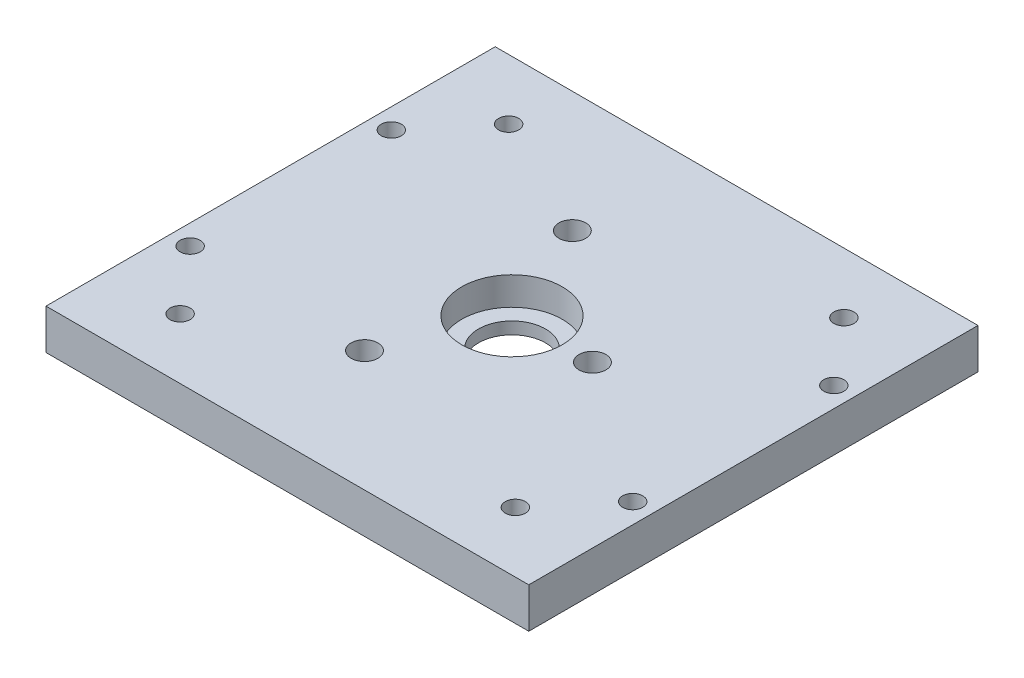
ISO-10303-21;
HEADER;
FILE_DESCRIPTION(('STEP AP214'),'2;1');
FILE_NAME('part.step','',(''),(''),'','','');
FILE_SCHEMA(('AUTOMOTIVE_DESIGN { 1 0 10303 214 1 1 1 1 }'));
ENDSEC;
DATA;
#1=APPLICATION_CONTEXT('core data for automotive mechanical design processes');
#2=APPLICATION_PROTOCOL_DEFINITION('international standard','automotive_design',2000,#1);
#3=PRODUCT_CONTEXT('',#1,'mechanical');
#4=PRODUCT('Part','Part','',(#3));
#5=PRODUCT_RELATED_PRODUCT_CATEGORY('part','',(#4));
#6=PRODUCT_DEFINITION_FORMATION('','',#4);
#7=PRODUCT_DEFINITION_CONTEXT('part definition',#1,'design');
#8=PRODUCT_DEFINITION('design','',#6,#7);
#9=PRODUCT_DEFINITION_SHAPE('','',#8);
#10=(LENGTH_UNIT() NAMED_UNIT(*) SI_UNIT(.MILLI.,.METRE.));
#11=(NAMED_UNIT(*) PLANE_ANGLE_UNIT() SI_UNIT($,.RADIAN.));
#12=(NAMED_UNIT(*) SI_UNIT($,.STERADIAN.) SOLID_ANGLE_UNIT());
#13=UNCERTAINTY_MEASURE_WITH_UNIT(LENGTH_MEASURE(1.E-05),#10,'distance_accuracy_value','');
#14=(GEOMETRIC_REPRESENTATION_CONTEXT(3) GLOBAL_UNCERTAINTY_ASSIGNED_CONTEXT((#13)) GLOBAL_UNIT_ASSIGNED_CONTEXT((#10,
#11,#12)) REPRESENTATION_CONTEXT('',''));
#15=CARTESIAN_POINT('',(0.,0.,0.));
#16=DIRECTION('',(0.,0.,1.));
#17=DIRECTION('',(1.,0.,0.));
#18=AXIS2_PLACEMENT_3D('',#15,#16,#17);
#19=CARTESIAN_POINT('',(0.,0.,0.));
#20=DIRECTION('',(0.,1.,0.));
#21=DIRECTION('',(0.,0.,1.));
#22=AXIS2_PLACEMENT_3D('',#19,#20,#21);
#23=CYLINDRICAL_SURFACE('',#22,5.);
#24=CARTESIAN_POINT('',(0.,0.,0.));
#25=DIRECTION('',(0.,1.,0.));
#26=DIRECTION('',(0.,0.,1.));
#27=AXIS2_PLACEMENT_3D('',#24,#25,#26);
#28=CIRCLE('',#27,5.);
#29=CARTESIAN_POINT('',(0.,0.,5.));
#30=VERTEX_POINT('',#29);
#31=EDGE_CURVE('E104',#30,#30,#28,.T.);
#32=ORIENTED_EDGE('',*,*,#31,.F.);
#33=EDGE_LOOP('',(#32));
#34=FACE_BOUND('',#33,.T.);
#35=CARTESIAN_POINT('',(0.,1.8,0.));
#36=DIRECTION('',(0.,1.,0.));
#37=DIRECTION('',(0.,0.,1.));
#38=AXIS2_PLACEMENT_3D('',#35,#36,#37);
#39=CIRCLE('',#38,5.);
#40=CARTESIAN_POINT('',(0.,1.8,5.));
#41=VERTEX_POINT('',#40);
#42=EDGE_CURVE('E109',#41,#41,#39,.F.);
#43=ORIENTED_EDGE('',*,*,#42,.F.);
#44=EDGE_LOOP('',(#43));
#45=FACE_BOUND('',#44,.T.);
#46=ADVANCED_FACE('F34',(#34,#45),#23,.F.);
#47=CARTESIAN_POINT('',(36.,6.,-33.5));
#48=DIRECTION('',(-1.,0.,0.));
#49=DIRECTION('',(0.,0.,1.));
#50=AXIS2_PLACEMENT_3D('',#47,#48,#49);
#51=PLANE('',#50);
#52=DIRECTION('',(0.,0.,-1.));
#53=VECTOR('',#52,1.);
#54=CARTESIAN_POINT('',(36.,0.,-33.5));
#55=LINE('',#54,#53);
#56=CARTESIAN_POINT('',(36.,0.,33.5));
#57=VERTEX_POINT('',#56);
#58=CARTESIAN_POINT('',(36.,0.,-33.5));
#59=VERTEX_POINT('',#58);
#60=EDGE_CURVE('E101',#57,#59,#55,.T.);
#61=ORIENTED_EDGE('',*,*,#60,.T.);
#62=DIRECTION('',(0.,-1.,0.));
#63=VECTOR('',#62,1.);
#64=CARTESIAN_POINT('',(36.,6.,-33.5));
#65=LINE('',#64,#63);
#66=CARTESIAN_POINT('',(36.,6.,-33.5));
#67=VERTEX_POINT('',#66);
#68=EDGE_CURVE('E11',#67,#59,#65,.T.);
#69=ORIENTED_EDGE('',*,*,#68,.F.);
#70=DIRECTION('',(0.,0.,-1.));
#71=VECTOR('',#70,1.);
#72=CARTESIAN_POINT('',(36.,6.,-33.5));
#73=LINE('',#72,#71);
#74=CARTESIAN_POINT('',(36.,6.,33.5));
#75=VERTEX_POINT('',#74);
#76=EDGE_CURVE('E88',#75,#67,#73,.T.);
#77=ORIENTED_EDGE('',*,*,#76,.F.);
#78=DIRECTION('',(0.,-1.,0.));
#79=VECTOR('',#78,1.);
#80=CARTESIAN_POINT('',(36.,6.,33.5));
#81=LINE('',#80,#79);
#82=EDGE_CURVE('E97',#75,#57,#81,.T.);
#83=ORIENTED_EDGE('',*,*,#82,.T.);
#84=EDGE_LOOP('',(#61,#69,#77,#83));
#85=FACE_BOUND('',#84,.T.);
#86=ADVANCED_FACE('F36',(#85),#51,.F.);
#87=CARTESIAN_POINT('',(-36.,6.,-33.5));
#88=DIRECTION('',(0.,0.,1.));
#89=DIRECTION('',(1.,0.,0.));
#90=AXIS2_PLACEMENT_3D('',#87,#88,#89);
#91=PLANE('',#90);
#92=DIRECTION('',(-1.,0.,0.));
#93=VECTOR('',#92,1.);
#94=CARTESIAN_POINT('',(-36.,0.,-33.5));
#95=LINE('',#94,#93);
#96=CARTESIAN_POINT('',(-36.,0.,-33.5));
#97=VERTEX_POINT('',#96);
#98=EDGE_CURVE('E92',#59,#97,#95,.T.);
#99=ORIENTED_EDGE('',*,*,#98,.T.);
#100=DIRECTION('',(0.,-1.,0.));
#101=VECTOR('',#100,1.);
#102=CARTESIAN_POINT('',(-36.,6.,-33.5));
#103=LINE('',#102,#101);
#104=CARTESIAN_POINT('',(-36.,6.,-33.5));
#105=VERTEX_POINT('',#104);
#106=EDGE_CURVE('E44',#105,#97,#103,.T.);
#107=ORIENTED_EDGE('',*,*,#106,.F.);
#108=DIRECTION('',(-1.,0.,0.));
#109=VECTOR('',#108,1.);
#110=CARTESIAN_POINT('',(-36.,6.,-33.5));
#111=LINE('',#110,#109);
#112=EDGE_CURVE('E83',#67,#105,#111,.T.);
#113=ORIENTED_EDGE('',*,*,#112,.F.);
#114=ORIENTED_EDGE('',*,*,#68,.T.);
#115=EDGE_LOOP('',(#99,#107,#113,#114));
#116=FACE_BOUND('',#115,.T.);
#117=ADVANCED_FACE('F91',(#116),#91,.F.);
#118=CARTESIAN_POINT('',(-36.,6.,-33.5));
#119=DIRECTION('',(1.,0.,0.));
#120=DIRECTION('',(0.,0.,-1.));
#121=AXIS2_PLACEMENT_3D('',#118,#119,#120);
#122=PLANE('',#121);
#123=DIRECTION('',(0.,0.,1.));
#124=VECTOR('',#123,1.);
#125=CARTESIAN_POINT('',(-36.,0.,-33.5));
#126=LINE('',#125,#124);
#127=CARTESIAN_POINT('',(-36.,0.,33.5));
#128=VERTEX_POINT('',#127);
#129=EDGE_CURVE('E70',#97,#128,#126,.T.);
#130=ORIENTED_EDGE('',*,*,#129,.T.);
#131=DIRECTION('',(0.,-1.,0.));
#132=VECTOR('',#131,1.);
#133=CARTESIAN_POINT('',(-36.,6.,33.5));
#134=LINE('',#133,#132);
#135=CARTESIAN_POINT('',(-36.,6.,33.5));
#136=VERTEX_POINT('',#135);
#137=EDGE_CURVE('E93',#136,#128,#134,.T.);
#138=ORIENTED_EDGE('',*,*,#137,.F.);
#139=DIRECTION('',(0.,0.,1.));
#140=VECTOR('',#139,1.);
#141=CARTESIAN_POINT('',(-36.,6.,-33.5));
#142=LINE('',#141,#140);
#143=EDGE_CURVE('E86',#105,#136,#142,.T.);
#144=ORIENTED_EDGE('',*,*,#143,.F.);
#145=ORIENTED_EDGE('',*,*,#106,.T.);
#146=EDGE_LOOP('',(#130,#138,#144,#145));
#147=FACE_BOUND('',#146,.T.);
#148=ADVANCED_FACE('F95',(#147),#122,.F.);
#149=CARTESIAN_POINT('',(-36.,6.,33.5));
#150=DIRECTION('',(0.,0.,-1.));
#151=DIRECTION('',(-1.,0.,0.));
#152=AXIS2_PLACEMENT_3D('',#149,#150,#151);
#153=PLANE('',#152);
#154=DIRECTION('',(1.,0.,0.));
#155=VECTOR('',#154,1.);
#156=CARTESIAN_POINT('',(-36.,0.,33.5));
#157=LINE('',#156,#155);
#158=EDGE_CURVE('E76',#128,#57,#157,.T.);
#159=ORIENTED_EDGE('',*,*,#158,.T.);
#160=ORIENTED_EDGE('',*,*,#82,.F.);
#161=DIRECTION('',(1.,0.,0.));
#162=VECTOR('',#161,1.);
#163=CARTESIAN_POINT('',(-36.,6.,33.5));
#164=LINE('',#163,#162);
#165=EDGE_CURVE('E53',#136,#75,#164,.T.);
#166=ORIENTED_EDGE('',*,*,#165,.F.);
#167=ORIENTED_EDGE('',*,*,#137,.T.);
#168=EDGE_LOOP('',(#159,#160,#166,#167));
#169=FACE_BOUND('',#168,.T.);
#170=ADVANCED_FACE('F156',(#169),#153,.F.);
#171=CARTESIAN_POINT('',(0.,6.,0.));
#172=DIRECTION('',(0.,1.,0.));
#173=DIRECTION('',(0.,0.,1.));
#174=AXIS2_PLACEMENT_3D('',#171,#172,#173);
#175=PLANE('',#174);
#176=CARTESIAN_POINT('',(25.,6.,24.5));
#177=DIRECTION('',(0.,1.,0.));
#178=DIRECTION('',(0.,0.,1.));
#179=AXIS2_PLACEMENT_3D('',#176,#177,#178);
#180=CIRCLE('',#179,1.5);
#181=CARTESIAN_POINT('',(25.,6.,26.));
#182=VERTEX_POINT('',#181);
#183=EDGE_CURVE('E324',#182,#182,#180,.T.);
#184=ORIENTED_EDGE('',*,*,#183,.F.);
#185=EDGE_LOOP('',(#184));
#186=FACE_BOUND('',#185,.T.);
#187=CARTESIAN_POINT('',(-33.,6.,15.));
#188=DIRECTION('',(0.,1.,0.));
#189=DIRECTION('',(0.,0.,1.));
#190=AXIS2_PLACEMENT_3D('',#187,#188,#189);
#191=CIRCLE('',#190,1.5);
#192=CARTESIAN_POINT('',(-33.,6.,16.5));
#193=VERTEX_POINT('',#192);
#194=EDGE_CURVE('E364',#193,#193,#191,.T.);
#195=ORIENTED_EDGE('',*,*,#194,.F.);
#196=EDGE_LOOP('',(#195));
#197=FACE_BOUND('',#196,.T.);
#198=CARTESIAN_POINT('',(33.,6.,15.));
#199=DIRECTION('',(0.,1.,0.));
#200=DIRECTION('',(0.,0.,1.));
#201=AXIS2_PLACEMENT_3D('',#198,#199,#200);
#202=CIRCLE('',#201,1.5);
#203=CARTESIAN_POINT('',(33.,6.,16.5));
#204=VERTEX_POINT('',#203);
#205=EDGE_CURVE('E361',#204,#204,#202,.T.);
#206=ORIENTED_EDGE('',*,*,#205,.F.);
#207=EDGE_LOOP('',(#206));
#208=FACE_BOUND('',#207,.T.);
#209=CARTESIAN_POINT('',(33.,6.,-15.));
#210=DIRECTION('',(0.,1.,0.));
#211=DIRECTION('',(0.,0.,1.));
#212=AXIS2_PLACEMENT_3D('',#209,#210,#211);
#213=CIRCLE('',#212,1.5);
#214=CARTESIAN_POINT('',(33.,6.,-13.5));
#215=VERTEX_POINT('',#214);
#216=EDGE_CURVE('E358',#215,#215,#213,.T.);
#217=ORIENTED_EDGE('',*,*,#216,.F.);
#218=EDGE_LOOP('',(#217));
#219=FACE_BOUND('',#218,.T.);
#220=CARTESIAN_POINT('',(-25.,6.,-24.5));
#221=DIRECTION('',(0.,1.,0.));
#222=DIRECTION('',(0.,0.,1.));
#223=AXIS2_PLACEMENT_3D('',#220,#221,#222);
#224=CIRCLE('',#223,1.5);
#225=CARTESIAN_POINT('',(-25.,6.,-23.));
#226=VERTEX_POINT('',#225);
#227=EDGE_CURVE('E355',#226,#226,#224,.T.);
#228=ORIENTED_EDGE('',*,*,#227,.F.);
#229=EDGE_LOOP('',(#228));
#230=FACE_BOUND('',#229,.T.);
#231=CARTESIAN_POINT('',(25.,6.,-24.5));
#232=DIRECTION('',(0.,1.,0.));
#233=DIRECTION('',(0.,0.,1.));
#234=AXIS2_PLACEMENT_3D('',#231,#232,#233);
#235=CIRCLE('',#234,1.5);
#236=CARTESIAN_POINT('',(25.,6.,-23.));
#237=VERTEX_POINT('',#236);
#238=EDGE_CURVE('E352',#237,#237,#235,.T.);
#239=ORIENTED_EDGE('',*,*,#238,.F.);
#240=EDGE_LOOP('',(#239));
#241=FACE_BOUND('',#240,.T.);
#242=CARTESIAN_POINT('',(-33.,6.,-15.));
#243=DIRECTION('',(0.,1.,0.));
#244=DIRECTION('',(0.,0.,1.));
#245=AXIS2_PLACEMENT_3D('',#242,#243,#244);
#246=CIRCLE('',#245,1.5);
#247=CARTESIAN_POINT('',(-33.,6.,-13.5));
#248=VERTEX_POINT('',#247);
#249=EDGE_CURVE('E349',#248,#248,#246,.T.);
#250=ORIENTED_EDGE('',*,*,#249,.F.);
#251=EDGE_LOOP('',(#250));
#252=FACE_BOUND('',#251,.T.);
#253=CARTESIAN_POINT('',(-25.,6.,24.5));
#254=DIRECTION('',(0.,1.,0.));
#255=DIRECTION('',(0.,0.,1.));
#256=AXIS2_PLACEMENT_3D('',#253,#254,#255);
#257=CIRCLE('',#256,1.5);
#258=CARTESIAN_POINT('',(-25.,6.,26.));
#259=VERTEX_POINT('',#258);
#260=EDGE_CURVE('E332',#259,#259,#257,.T.);
#261=ORIENTED_EDGE('',*,*,#260,.F.);
#262=EDGE_LOOP('',(#261));
#263=FACE_BOUND('',#262,.T.);
#264=CARTESIAN_POINT('',(12.,6.,0.));
#265=DIRECTION('',(0.,1.,0.));
#266=DIRECTION('',(0.,0.,1.));
#267=AXIS2_PLACEMENT_3D('',#264,#265,#266);
#268=CIRCLE('',#267,2.);
#269=CARTESIAN_POINT('',(12.,6.,2.));
#270=VERTEX_POINT('',#269);
#271=EDGE_CURVE('E126',#270,#270,#268,.T.);
#272=ORIENTED_EDGE('',*,*,#271,.F.);
#273=EDGE_LOOP('',(#272));
#274=FACE_BOUND('',#273,.T.);
#275=CARTESIAN_POINT('',(0.,6.,0.));
#276=DIRECTION('',(0.,1.,0.));
#277=DIRECTION('',(0.,0.,1.));
#278=AXIS2_PLACEMENT_3D('',#275,#276,#277);
#279=CIRCLE('',#278,7.5);
#280=CARTESIAN_POINT('',(0.,6.,7.5));
#281=VERTEX_POINT('',#280);
#282=EDGE_CURVE('E119',#281,#281,#279,.T.);
#283=ORIENTED_EDGE('',*,*,#282,.F.);
#284=EDGE_LOOP('',(#283));
#285=FACE_BOUND('',#284,.T.);
#286=CARTESIAN_POINT('',(-6.5,6.,15.5));
#287=DIRECTION('',(0.,1.,0.));
#288=DIRECTION('',(0.,0.,1.));
#289=AXIS2_PLACEMENT_3D('',#286,#287,#288);
#290=CIRCLE('',#289,2.);
#291=CARTESIAN_POINT('',(-6.5,6.,17.5));
#292=VERTEX_POINT('',#291);
#293=EDGE_CURVE('E111',#292,#292,#290,.T.);
#294=ORIENTED_EDGE('',*,*,#293,.F.);
#295=EDGE_LOOP('',(#294));
#296=FACE_BOUND('',#295,.T.);
#297=CARTESIAN_POINT('',(-6.50000000000001,6.,-15.5));
#298=DIRECTION('',(0.,1.,0.));
#299=DIRECTION('',(0.,0.,1.));
#300=AXIS2_PLACEMENT_3D('',#297,#298,#299);
#301=CIRCLE('',#300,2.);
#302=CARTESIAN_POINT('',(-6.50000000000001,6.,-13.5));
#303=VERTEX_POINT('',#302);
#304=EDGE_CURVE('E132',#303,#303,#301,.T.);
#305=ORIENTED_EDGE('',*,*,#304,.F.);
#306=EDGE_LOOP('',(#305));
#307=FACE_BOUND('',#306,.T.);
#308=ORIENTED_EDGE('',*,*,#76,.T.);
#309=ORIENTED_EDGE('',*,*,#112,.T.);
#310=ORIENTED_EDGE('',*,*,#143,.T.);
#311=ORIENTED_EDGE('',*,*,#165,.T.);
#312=EDGE_LOOP('',(#308,#309,#310,#311));
#313=FACE_BOUND('',#312,.T.);
#314=ADVANCED_FACE('F84',(#186,#197,#208,#219,#230,#241,#252,#263,#274,#285,#296,#307,#313),
#175,.T.);
#315=CARTESIAN_POINT('',(0.,0.,0.));
#316=DIRECTION('',(0.,1.,0.));
#317=DIRECTION('',(0.,0.,1.));
#318=AXIS2_PLACEMENT_3D('',#315,#316,#317);
#319=PLANE('',#318);
#320=CARTESIAN_POINT('',(25.,0.,24.5));
#321=DIRECTION('',(0.,-1.,0.));
#322=DIRECTION('',(0.,0.,1.));
#323=AXIS2_PLACEMENT_3D('',#320,#321,#322);
#324=CIRCLE('',#323,1.5);
#325=CARTESIAN_POINT('',(25.,0.,26.));
#326=VERTEX_POINT('',#325);
#327=EDGE_CURVE('E327',#326,#326,#324,.T.);
#328=ORIENTED_EDGE('',*,*,#327,.F.);
#329=EDGE_LOOP('',(#328));
#330=FACE_BOUND('',#329,.T.);
#331=CARTESIAN_POINT('',(-33.,0.,15.));
#332=DIRECTION('',(0.,-1.,0.));
#333=DIRECTION('',(0.,0.,-1.));
#334=AXIS2_PLACEMENT_3D('',#331,#332,#333);
#335=CIRCLE('',#334,1.5);
#336=CARTESIAN_POINT('',(-33.,0.,13.5));
#337=VERTEX_POINT('',#336);
#338=EDGE_CURVE('E329',#337,#337,#335,.T.);
#339=ORIENTED_EDGE('',*,*,#338,.F.);
#340=EDGE_LOOP('',(#339));
#341=FACE_BOUND('',#340,.T.);
#342=CARTESIAN_POINT('',(33.,0.,15.));
#343=DIRECTION('',(0.,-1.,0.));
#344=DIRECTION('',(0.,0.,1.));
#345=AXIS2_PLACEMENT_3D('',#342,#343,#344);
#346=CIRCLE('',#345,1.5);
#347=CARTESIAN_POINT('',(33.,0.,16.5));
#348=VERTEX_POINT('',#347);
#349=EDGE_CURVE('E335',#348,#348,#346,.T.);
#350=ORIENTED_EDGE('',*,*,#349,.F.);
#351=EDGE_LOOP('',(#350));
#352=FACE_BOUND('',#351,.T.);
#353=CARTESIAN_POINT('',(33.,0.,-15.));
#354=DIRECTION('',(0.,-1.,0.));
#355=DIRECTION('',(0.,0.,-1.));
#356=AXIS2_PLACEMENT_3D('',#353,#354,#355);
#357=CIRCLE('',#356,1.5);
#358=CARTESIAN_POINT('',(33.,0.,-16.5));
#359=VERTEX_POINT('',#358);
#360=EDGE_CURVE('E343',#359,#359,#357,.T.);
#361=ORIENTED_EDGE('',*,*,#360,.F.);
#362=EDGE_LOOP('',(#361));
#363=FACE_BOUND('',#362,.T.);
#364=CARTESIAN_POINT('',(-25.,0.,-24.5));
#365=DIRECTION('',(0.,-1.,0.));
#366=DIRECTION('',(0.,0.,1.));
#367=AXIS2_PLACEMENT_3D('',#364,#365,#366);
#368=CIRCLE('',#367,1.5);
#369=CARTESIAN_POINT('',(-25.,0.,-23.));
#370=VERTEX_POINT('',#369);
#371=EDGE_CURVE('E409',#370,#370,#368,.T.);
#372=ORIENTED_EDGE('',*,*,#371,.F.);
#373=EDGE_LOOP('',(#372));
#374=FACE_BOUND('',#373,.T.);
#375=CARTESIAN_POINT('',(25.,0.,-24.5));
#376=DIRECTION('',(0.,-1.,0.));
#377=DIRECTION('',(0.,0.,-1.));
#378=AXIS2_PLACEMENT_3D('',#375,#376,#377);
#379=CIRCLE('',#378,1.5);
#380=CARTESIAN_POINT('',(25.,0.,-26.));
#381=VERTEX_POINT('',#380);
#382=EDGE_CURVE('E338',#381,#381,#379,.T.);
#383=ORIENTED_EDGE('',*,*,#382,.F.);
#384=EDGE_LOOP('',(#383));
#385=FACE_BOUND('',#384,.T.);
#386=CARTESIAN_POINT('',(-33.,0.,-15.));
#387=DIRECTION('',(0.,-1.,0.));
#388=DIRECTION('',(0.,0.,1.));
#389=AXIS2_PLACEMENT_3D('',#386,#387,#388);
#390=CIRCLE('',#389,1.5);
#391=CARTESIAN_POINT('',(-33.,0.,-13.5));
#392=VERTEX_POINT('',#391);
#393=EDGE_CURVE('E345',#392,#392,#390,.T.);
#394=ORIENTED_EDGE('',*,*,#393,.F.);
#395=EDGE_LOOP('',(#394));
#396=FACE_BOUND('',#395,.T.);
#397=CARTESIAN_POINT('',(-25.,0.,24.5));
#398=DIRECTION('',(0.,-1.,0.));
#399=DIRECTION('',(0.,0.,-1.));
#400=AXIS2_PLACEMENT_3D('',#397,#398,#399);
#401=CIRCLE('',#400,1.5);
#402=CARTESIAN_POINT('',(-25.,0.,23.));
#403=VERTEX_POINT('',#402);
#404=EDGE_CURVE('E328',#403,#403,#401,.T.);
#405=ORIENTED_EDGE('',*,*,#404,.F.);
#406=EDGE_LOOP('',(#405));
#407=FACE_BOUND('',#406,.T.);
#408=CARTESIAN_POINT('',(12.,0.,0.));
#409=DIRECTION('',(0.,1.,0.));
#410=DIRECTION('',(0.,0.,1.));
#411=AXIS2_PLACEMENT_3D('',#408,#409,#410);
#412=CIRCLE('',#411,2.);
#413=CARTESIAN_POINT('',(12.,0.,2.));
#414=VERTEX_POINT('',#413);
#415=EDGE_CURVE('E38',#414,#414,#412,.T.);
#416=ORIENTED_EDGE('',*,*,#415,.T.);
#417=EDGE_LOOP('',(#416));
#418=FACE_BOUND('',#417,.T.);
#419=CARTESIAN_POINT('',(-6.5,0.,15.5));
#420=DIRECTION('',(0.,1.,0.));
#421=DIRECTION('',(0.,0.,1.));
#422=AXIS2_PLACEMENT_3D('',#419,#420,#421);
#423=CIRCLE('',#422,2.);
#424=CARTESIAN_POINT('',(-6.5,0.,17.5));
#425=VERTEX_POINT('',#424);
#426=EDGE_CURVE('E116',#425,#425,#423,.T.);
#427=ORIENTED_EDGE('',*,*,#426,.T.);
#428=EDGE_LOOP('',(#427));
#429=FACE_BOUND('',#428,.T.);
#430=CARTESIAN_POINT('',(-6.50000000000001,0.,-15.5));
#431=DIRECTION('',(0.,1.,0.));
#432=DIRECTION('',(0.,0.,1.));
#433=AXIS2_PLACEMENT_3D('',#430,#431,#432);
#434=CIRCLE('',#433,2.);
#435=CARTESIAN_POINT('',(-6.50000000000001,0.,-13.5));
#436=VERTEX_POINT('',#435);
#437=EDGE_CURVE('E129',#436,#436,#434,.T.);
#438=ORIENTED_EDGE('',*,*,#437,.T.);
#439=EDGE_LOOP('',(#438));
#440=FACE_BOUND('',#439,.T.);
#441=ORIENTED_EDGE('',*,*,#31,.T.);
#442=EDGE_LOOP('',(#441));
#443=FACE_BOUND('',#442,.T.);
#444=ORIENTED_EDGE('',*,*,#60,.F.);
#445=ORIENTED_EDGE('',*,*,#158,.F.);
#446=ORIENTED_EDGE('',*,*,#129,.F.);
#447=ORIENTED_EDGE('',*,*,#98,.F.);
#448=EDGE_LOOP('',(#444,#445,#446,#447));
#449=FACE_BOUND('',#448,.T.);
#450=ADVANCED_FACE('F140',(#330,#341,#352,#363,#374,#385,#396,#407,#418,#429,#440,#443,#449),
#319,.F.);
#451=CARTESIAN_POINT('',(-6.50000000000001,0.,-15.5));
#452=DIRECTION('',(0.,1.,0.));
#453=DIRECTION('',(0.,0.,1.));
#454=AXIS2_PLACEMENT_3D('',#451,#452,#453);
#455=CYLINDRICAL_SURFACE('',#454,2.);
#456=ORIENTED_EDGE('',*,*,#437,.F.);
#457=EDGE_LOOP('',(#456));
#458=FACE_BOUND('',#457,.T.);
#459=ORIENTED_EDGE('',*,*,#304,.T.);
#460=EDGE_LOOP('',(#459));
#461=FACE_BOUND('',#460,.T.);
#462=ADVANCED_FACE('F160',(#458,#461),#455,.F.);
#463=CARTESIAN_POINT('',(-6.5,0.,15.5));
#464=DIRECTION('',(0.,1.,0.));
#465=DIRECTION('',(0.,0.,1.));
#466=AXIS2_PLACEMENT_3D('',#463,#464,#465);
#467=CYLINDRICAL_SURFACE('',#466,2.);
#468=ORIENTED_EDGE('',*,*,#426,.F.);
#469=EDGE_LOOP('',(#468));
#470=FACE_BOUND('',#469,.T.);
#471=ORIENTED_EDGE('',*,*,#293,.T.);
#472=EDGE_LOOP('',(#471));
#473=FACE_BOUND('',#472,.T.);
#474=ADVANCED_FACE('F152',(#470,#473),#467,.F.);
#475=CARTESIAN_POINT('',(0.,1.8,0.));
#476=DIRECTION('',(0.,1.,0.));
#477=DIRECTION('',(0.,0.,1.));
#478=AXIS2_PLACEMENT_3D('',#475,#476,#477);
#479=PLANE('',#478);
#480=CARTESIAN_POINT('',(0.,1.8,0.));
#481=DIRECTION('',(0.,1.,0.));
#482=DIRECTION('',(0.,0.,1.));
#483=AXIS2_PLACEMENT_3D('',#480,#481,#482);
#484=CIRCLE('',#483,7.5);
#485=CARTESIAN_POINT('',(0.,1.8,7.5));
#486=VERTEX_POINT('',#485);
#487=EDGE_CURVE('E112',#486,#486,#484,.T.);
#488=ORIENTED_EDGE('',*,*,#487,.T.);
#489=EDGE_LOOP('',(#488));
#490=FACE_BOUND('',#489,.T.);
#491=ORIENTED_EDGE('',*,*,#42,.T.);
#492=EDGE_LOOP('',(#491));
#493=FACE_BOUND('',#492,.T.);
#494=ADVANCED_FACE('F204',(#490,#493),#479,.T.);
#495=CARTESIAN_POINT('',(0.,1.8,0.));
#496=DIRECTION('',(0.,1.,0.));
#497=DIRECTION('',(0.,0.,1.));
#498=AXIS2_PLACEMENT_3D('',#495,#496,#497);
#499=CYLINDRICAL_SURFACE('',#498,7.5);
#500=ORIENTED_EDGE('',*,*,#487,.F.);
#501=EDGE_LOOP('',(#500));
#502=FACE_BOUND('',#501,.T.);
#503=ORIENTED_EDGE('',*,*,#282,.T.);
#504=EDGE_LOOP('',(#503));
#505=FACE_BOUND('',#504,.T.);
#506=ADVANCED_FACE('F211',(#502,#505),#499,.F.);
#507=CARTESIAN_POINT('',(12.,-4.,0.));
#508=DIRECTION('',(0.,1.,0.));
#509=DIRECTION('',(0.,0.,1.));
#510=AXIS2_PLACEMENT_3D('',#507,#508,#509);
#511=CYLINDRICAL_SURFACE('',#510,2.);
#512=ORIENTED_EDGE('',*,*,#271,.T.);
#513=EDGE_LOOP('',(#512));
#514=FACE_BOUND('',#513,.T.);
#515=ORIENTED_EDGE('',*,*,#415,.F.);
#516=EDGE_LOOP('',(#515));
#517=FACE_BOUND('',#516,.T.);
#518=ADVANCED_FACE('F218',(#514,#517),#511,.F.);
#519=CARTESIAN_POINT('',(-25.,10.,24.5));
#520=DIRECTION('',(0.,-1.,0.));
#521=DIRECTION('',(0.,0.,-1.));
#522=AXIS2_PLACEMENT_3D('',#519,#520,#521);
#523=CYLINDRICAL_SURFACE('',#522,1.5);
#524=ORIENTED_EDGE('',*,*,#260,.T.);
#525=EDGE_LOOP('',(#524));
#526=FACE_BOUND('',#525,.T.);
#527=ORIENTED_EDGE('',*,*,#404,.T.);
#528=EDGE_LOOP('',(#527));
#529=FACE_BOUND('',#528,.T.);
#530=ADVANCED_FACE('F225',(#526,#529),#523,.F.);
#531=CARTESIAN_POINT('',(-33.,10.,-15.));
#532=DIRECTION('',(0.,-1.,0.));
#533=DIRECTION('',(0.,0.,-1.));
#534=AXIS2_PLACEMENT_3D('',#531,#532,#533);
#535=CYLINDRICAL_SURFACE('',#534,1.5);
#536=ORIENTED_EDGE('',*,*,#249,.T.);
#537=EDGE_LOOP('',(#536));
#538=FACE_BOUND('',#537,.T.);
#539=ORIENTED_EDGE('',*,*,#393,.T.);
#540=EDGE_LOOP('',(#539));
#541=FACE_BOUND('',#540,.T.);
#542=ADVANCED_FACE('F232',(#538,#541),#535,.F.);
#543=CARTESIAN_POINT('',(25.,10.,-24.5));
#544=DIRECTION('',(0.,-1.,0.));
#545=DIRECTION('',(0.,0.,-1.));
#546=AXIS2_PLACEMENT_3D('',#543,#544,#545);
#547=CYLINDRICAL_SURFACE('',#546,1.5);
#548=ORIENTED_EDGE('',*,*,#238,.T.);
#549=EDGE_LOOP('',(#548));
#550=FACE_BOUND('',#549,.T.);
#551=ORIENTED_EDGE('',*,*,#382,.T.);
#552=EDGE_LOOP('',(#551));
#553=FACE_BOUND('',#552,.T.);
#554=ADVANCED_FACE('F240',(#550,#553),#547,.F.);
#555=CARTESIAN_POINT('',(-25.,10.,-24.5));
#556=DIRECTION('',(0.,-1.,0.));
#557=DIRECTION('',(0.,0.,-1.));
#558=AXIS2_PLACEMENT_3D('',#555,#556,#557);
#559=CYLINDRICAL_SURFACE('',#558,1.5);
#560=ORIENTED_EDGE('',*,*,#227,.T.);
#561=EDGE_LOOP('',(#560));
#562=FACE_BOUND('',#561,.T.);
#563=ORIENTED_EDGE('',*,*,#371,.T.);
#564=EDGE_LOOP('',(#563));
#565=FACE_BOUND('',#564,.T.);
#566=ADVANCED_FACE('F248',(#562,#565),#559,.F.);
#567=CARTESIAN_POINT('',(33.,10.,-15.));
#568=DIRECTION('',(0.,-1.,0.));
#569=DIRECTION('',(0.,0.,-1.));
#570=AXIS2_PLACEMENT_3D('',#567,#568,#569);
#571=CYLINDRICAL_SURFACE('',#570,1.5);
#572=ORIENTED_EDGE('',*,*,#216,.T.);
#573=EDGE_LOOP('',(#572));
#574=FACE_BOUND('',#573,.T.);
#575=ORIENTED_EDGE('',*,*,#360,.T.);
#576=EDGE_LOOP('',(#575));
#577=FACE_BOUND('',#576,.T.);
#578=ADVANCED_FACE('F256',(#574,#577),#571,.F.);
#579=CARTESIAN_POINT('',(33.,10.,15.));
#580=DIRECTION('',(0.,-1.,0.));
#581=DIRECTION('',(0.,0.,-1.));
#582=AXIS2_PLACEMENT_3D('',#579,#580,#581);
#583=CYLINDRICAL_SURFACE('',#582,1.5);
#584=ORIENTED_EDGE('',*,*,#205,.T.);
#585=EDGE_LOOP('',(#584));
#586=FACE_BOUND('',#585,.T.);
#587=ORIENTED_EDGE('',*,*,#349,.T.);
#588=EDGE_LOOP('',(#587));
#589=FACE_BOUND('',#588,.T.);
#590=ADVANCED_FACE('F264',(#586,#589),#583,.F.);
#591=CARTESIAN_POINT('',(-33.,10.,15.));
#592=DIRECTION('',(0.,-1.,0.));
#593=DIRECTION('',(0.,0.,-1.));
#594=AXIS2_PLACEMENT_3D('',#591,#592,#593);
#595=CYLINDRICAL_SURFACE('',#594,1.5);
#596=ORIENTED_EDGE('',*,*,#194,.T.);
#597=EDGE_LOOP('',(#596));
#598=FACE_BOUND('',#597,.T.);
#599=ORIENTED_EDGE('',*,*,#338,.T.);
#600=EDGE_LOOP('',(#599));
#601=FACE_BOUND('',#600,.T.);
#602=ADVANCED_FACE('F272',(#598,#601),#595,.F.);
#603=CARTESIAN_POINT('',(25.,10.,24.5));
#604=DIRECTION('',(0.,-1.,0.));
#605=DIRECTION('',(0.,0.,-1.));
#606=AXIS2_PLACEMENT_3D('',#603,#604,#605);
#607=CYLINDRICAL_SURFACE('',#606,1.5);
#608=ORIENTED_EDGE('',*,*,#183,.T.);
#609=EDGE_LOOP('',(#608));
#610=FACE_BOUND('',#609,.T.);
#611=ORIENTED_EDGE('',*,*,#327,.T.);
#612=EDGE_LOOP('',(#611));
#613=FACE_BOUND('',#612,.T.);
#614=ADVANCED_FACE('F280',(#610,#613),#607,.F.);
#615=CLOSED_SHELL('',(#46,#86,#117,#148,#170,#314,#450,#462,#474,#494,#506,#518,#530,#542,#554,
#566,#578,#590,#602,#614));
#616=MANIFOLD_SOLID_BREP('B2',#615);
#617=ADVANCED_BREP_SHAPE_REPRESENTATION('',(#18,#616),#14);
#618=SHAPE_DEFINITION_REPRESENTATION(#9,#617);
ENDSEC;
END-ISO-10303-21;
